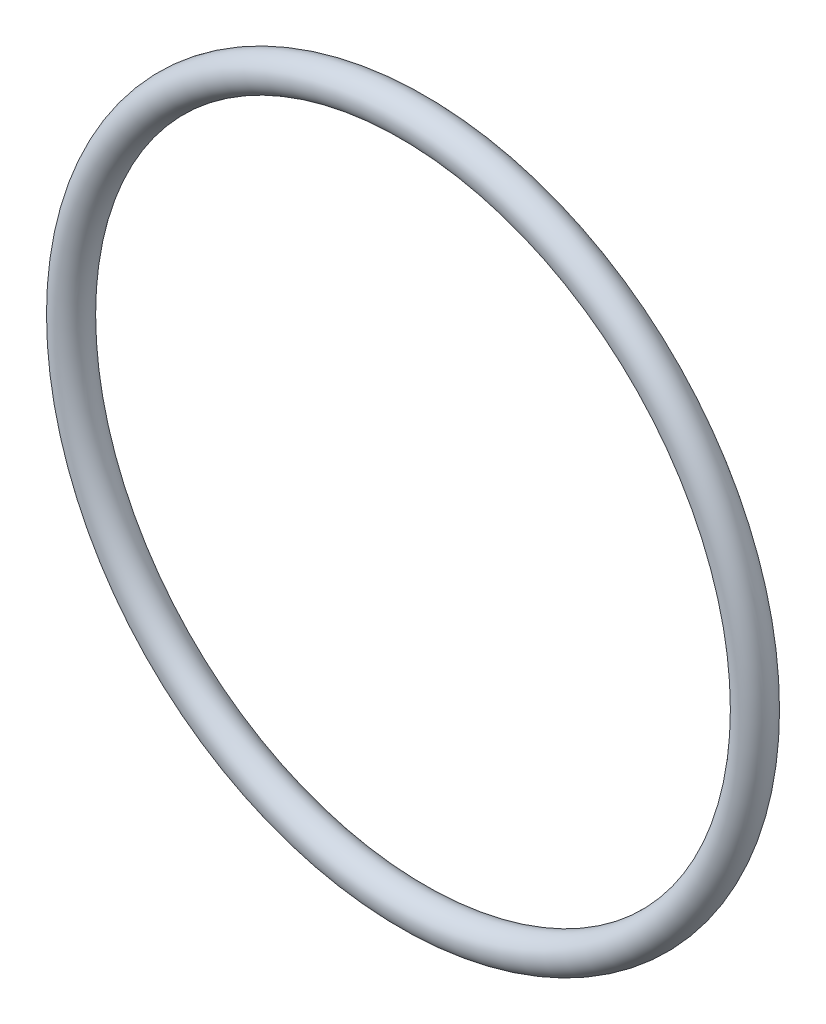
ISO-10303-21;
HEADER;
FILE_DESCRIPTION(('STEP AP214'),'2;1');
FILE_NAME('part.step','',(''),(''),'','','');
FILE_SCHEMA(('AUTOMOTIVE_DESIGN { 1 0 10303 214 1 1 1 1 }'));
ENDSEC;
DATA;
#1=APPLICATION_CONTEXT('core data for automotive mechanical design processes');
#2=APPLICATION_PROTOCOL_DEFINITION('international standard','automotive_design',2000,#1);
#3=PRODUCT_CONTEXT('',#1,'mechanical');
#4=PRODUCT('Part','Part','',(#3));
#5=PRODUCT_RELATED_PRODUCT_CATEGORY('part','',(#4));
#6=PRODUCT_DEFINITION_FORMATION('','',#4);
#7=PRODUCT_DEFINITION_CONTEXT('part definition',#1,'design');
#8=PRODUCT_DEFINITION('design','',#6,#7);
#9=PRODUCT_DEFINITION_SHAPE('','',#8);
#10=(LENGTH_UNIT() NAMED_UNIT(*) SI_UNIT(.MILLI.,.METRE.));
#11=(NAMED_UNIT(*) PLANE_ANGLE_UNIT() SI_UNIT($,.RADIAN.));
#12=(NAMED_UNIT(*) SI_UNIT($,.STERADIAN.) SOLID_ANGLE_UNIT());
#13=UNCERTAINTY_MEASURE_WITH_UNIT(LENGTH_MEASURE(1.E-05),#10,'distance_accuracy_value','');
#14=(GEOMETRIC_REPRESENTATION_CONTEXT(3) GLOBAL_UNCERTAINTY_ASSIGNED_CONTEXT((#13)) GLOBAL_UNIT_ASSIGNED_CONTEXT((#10,
#11,#12)) REPRESENTATION_CONTEXT('',''));
#15=CARTESIAN_POINT('',(0.,0.,0.));
#16=DIRECTION('',(0.,0.,1.));
#17=DIRECTION('',(1.,0.,0.));
#18=AXIS2_PLACEMENT_3D('',#15,#16,#17);
#19=CARTESIAN_POINT('',(0.,0.,0.));
#20=DIRECTION('',(0.,0.,1.));
#21=DIRECTION('',(1.,0.,0.));
#22=AXIS2_PLACEMENT_3D('',#19,#20,#21);
#23=TOROIDAL_SURFACE('',#22,29.5,1.5);
#24=CARTESIAN_POINT('',(31.,0.,0.));
#25=VERTEX_POINT('',#24);
#26=VERTEX_LOOP('',#25);
#27=FACE_BOUND('',#26,.T.);
#28=ADVANCED_FACE('F35',(#27),#23,.T.);
#29=CLOSED_SHELL('',(#28));
#30=MANIFOLD_SOLID_BREP('B2',#29);
#31=ADVANCED_BREP_SHAPE_REPRESENTATION('',(#18,#30),#14);
#32=SHAPE_DEFINITION_REPRESENTATION(#9,#31);
ENDSEC;
END-ISO-10303-21;
